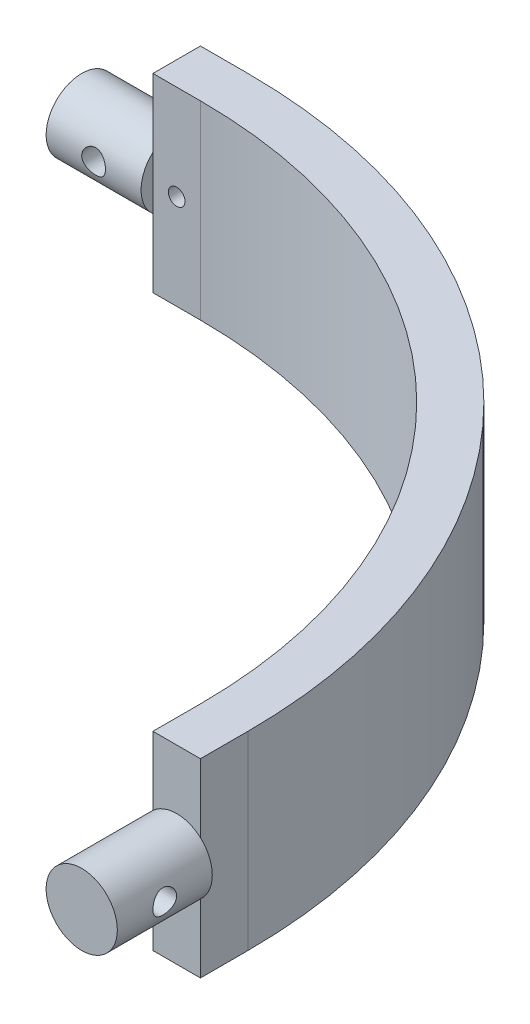
ISO-10303-21;
HEADER;
FILE_DESCRIPTION(('STEP AP214'),'2;1');
FILE_NAME('part.step','',(''),(''),'','','');
FILE_SCHEMA(('AUTOMOTIVE_DESIGN { 1 0 10303 214 1 1 1 1 }'));
ENDSEC;
DATA;
#1=APPLICATION_CONTEXT('core data for automotive mechanical design processes');
#2=APPLICATION_PROTOCOL_DEFINITION('international standard','automotive_design',2000,#1);
#3=PRODUCT_CONTEXT('',#1,'mechanical');
#4=PRODUCT('Part','Part','',(#3));
#5=PRODUCT_RELATED_PRODUCT_CATEGORY('part','',(#4));
#6=PRODUCT_DEFINITION_FORMATION('','',#4);
#7=PRODUCT_DEFINITION_CONTEXT('part definition',#1,'design');
#8=PRODUCT_DEFINITION('design','',#6,#7);
#9=PRODUCT_DEFINITION_SHAPE('','',#8);
#10=(LENGTH_UNIT() NAMED_UNIT(*) SI_UNIT(.MILLI.,.METRE.));
#11=(NAMED_UNIT(*) PLANE_ANGLE_UNIT() SI_UNIT($,.RADIAN.));
#12=(NAMED_UNIT(*) SI_UNIT($,.STERADIAN.) SOLID_ANGLE_UNIT());
#13=UNCERTAINTY_MEASURE_WITH_UNIT(LENGTH_MEASURE(1.E-05),#10,'distance_accuracy_value','');
#14=(GEOMETRIC_REPRESENTATION_CONTEXT(3) GLOBAL_UNCERTAINTY_ASSIGNED_CONTEXT((#13)) GLOBAL_UNIT_ASSIGNED_CONTEXT((#10,
#11,#12)) REPRESENTATION_CONTEXT('',''));
#15=CARTESIAN_POINT('',(0.,0.,0.));
#16=DIRECTION('',(0.,0.,1.));
#17=DIRECTION('',(1.,0.,0.));
#18=AXIS2_PLACEMENT_3D('',#15,#16,#17);
#19=CARTESIAN_POINT('',(0.,0.,12.7));
#20=DIRECTION('',(0.,0.,1.));
#21=DIRECTION('',(1.,0.,0.));
#22=AXIS2_PLACEMENT_3D('',#19,#20,#21);
#23=PLANE('',#22);
#24=CARTESIAN_POINT('',(146.05,0.,12.7));
#25=DIRECTION('',(0.,0.,1.));
#26=DIRECTION('',(1.,0.,0.));
#27=AXIS2_PLACEMENT_3D('',#24,#25,#26);
#28=CIRCLE('',#27,9.525);
#29=CARTESIAN_POINT('',(152.4,7.09951582856183,12.7));
#30=VERTEX_POINT('',#29);
#31=CARTESIAN_POINT('',(139.7,7.09951582856183,12.7));
#32=VERTEX_POINT('',#31);
#33=EDGE_CURVE('E48',#30,#32,#28,.T.);
#34=ORIENTED_EDGE('',*,*,#33,.F.);
#35=DIRECTION('',(0.,1.,0.));
#36=VECTOR('',#35,1.);
#37=CARTESIAN_POINT('',(152.4,25.4,12.7));
#38=LINE('',#37,#36);
#39=CARTESIAN_POINT('',(152.4,25.4,12.7));
#40=VERTEX_POINT('',#39);
#41=EDGE_CURVE('E137',#30,#40,#38,.T.);
#42=ORIENTED_EDGE('',*,*,#41,.T.);
#43=DIRECTION('',(-1.,0.,0.));
#44=VECTOR('',#43,1.);
#45=CARTESIAN_POINT('',(139.7,25.4,12.7));
#46=LINE('',#45,#44);
#47=CARTESIAN_POINT('',(139.7,25.4,12.7));
#48=VERTEX_POINT('',#47);
#49=EDGE_CURVE('E134',#40,#48,#46,.T.);
#50=ORIENTED_EDGE('',*,*,#49,.T.);
#51=DIRECTION('',(0.,-1.,0.));
#52=VECTOR('',#51,1.);
#53=CARTESIAN_POINT('',(139.7,25.4,12.7));
#54=LINE('',#53,#52);
#55=EDGE_CURVE('E166',#48,#32,#54,.T.);
#56=ORIENTED_EDGE('',*,*,#55,.T.);
#57=EDGE_LOOP('',(#34,#42,#50,#56));
#58=FACE_BOUND('',#57,.T.);
#59=ADVANCED_FACE('F33',(#58),#23,.T.);
#60=CARTESIAN_POINT('',(-12.7,0.,0.));
#61=DIRECTION('',(-1.,0.,0.));
#62=DIRECTION('',(0.,0.,1.));
#63=AXIS2_PLACEMENT_3D('',#60,#61,#62);
#64=PLANE('',#63);
#65=CARTESIAN_POINT('',(-12.7,0.,-146.05));
#66=DIRECTION('',(-1.,0.,0.));
#67=DIRECTION('',(0.,0.,1.));
#68=AXIS2_PLACEMENT_3D('',#65,#66,#67);
#69=CIRCLE('',#68,9.525);
#70=CARTESIAN_POINT('',(-12.7,7.09951582856183,-139.7));
#71=VERTEX_POINT('',#70);
#72=CARTESIAN_POINT('',(-12.7,7.09951582856183,-152.4));
#73=VERTEX_POINT('',#72);
#74=EDGE_CURVE('E161',#71,#73,#69,.T.);
#75=ORIENTED_EDGE('',*,*,#74,.F.);
#76=DIRECTION('',(0.,1.,0.));
#77=VECTOR('',#76,1.);
#78=CARTESIAN_POINT('',(-12.7,25.4,-139.7));
#79=LINE('',#78,#77);
#80=CARTESIAN_POINT('',(-12.7,25.4,-139.7));
#81=VERTEX_POINT('',#80);
#82=EDGE_CURVE('E189',#71,#81,#79,.T.);
#83=ORIENTED_EDGE('',*,*,#82,.T.);
#84=DIRECTION('',(0.,0.,-1.));
#85=VECTOR('',#84,1.);
#86=CARTESIAN_POINT('',(-12.7,25.4,-152.4));
#87=LINE('',#86,#85);
#88=CARTESIAN_POINT('',(-12.7,25.4,-152.4));
#89=VERTEX_POINT('',#88);
#90=EDGE_CURVE('E192',#81,#89,#87,.T.);
#91=ORIENTED_EDGE('',*,*,#90,.T.);
#92=DIRECTION('',(0.,-1.,0.));
#93=VECTOR('',#92,1.);
#94=CARTESIAN_POINT('',(-12.7,25.4,-152.4));
#95=LINE('',#94,#93);
#96=EDGE_CURVE('E183',#89,#73,#95,.T.);
#97=ORIENTED_EDGE('',*,*,#96,.T.);
#98=EDGE_LOOP('',(#75,#83,#91,#97));
#99=FACE_BOUND('',#98,.T.);
#100=ADVANCED_FACE('F262',(#99),#64,.T.);
#101=CARTESIAN_POINT('',(0.,25.4,0.));
#102=DIRECTION('',(0.,-1.,0.));
#103=DIRECTION('',(0.,0.,-1.));
#104=AXIS2_PLACEMENT_3D('',#101,#102,#103);
#105=CYLINDRICAL_SURFACE('',#104,152.4);
#106=CARTESIAN_POINT('',(0.,-25.4,0.));
#107=DIRECTION('',(0.,1.,0.));
#108=DIRECTION('',(0.,0.,1.));
#109=AXIS2_PLACEMENT_3D('',#106,#107,#108);
#110=CIRCLE('',#109,152.4);
#111=CARTESIAN_POINT('',(152.4,-25.4,0.));
#112=VERTEX_POINT('',#111);
#113=CARTESIAN_POINT('',(0.,-25.4,-152.4));
#114=VERTEX_POINT('',#113);
#115=EDGE_CURVE('E207',#112,#114,#110,.T.);
#116=ORIENTED_EDGE('',*,*,#115,.T.);
#117=DIRECTION('',(0.,-1.,0.));
#118=VECTOR('',#117,1.);
#119=CARTESIAN_POINT('',(0.,25.4,-152.4));
#120=LINE('',#119,#118);
#121=CARTESIAN_POINT('',(0.,25.4,-152.4));
#122=VERTEX_POINT('',#121);
#123=EDGE_CURVE('E222',#122,#114,#120,.T.);
#124=ORIENTED_EDGE('',*,*,#123,.F.);
#125=CARTESIAN_POINT('',(0.,25.4,0.));
#126=DIRECTION('',(0.,1.,0.));
#127=DIRECTION('',(0.,0.,1.));
#128=AXIS2_PLACEMENT_3D('',#125,#126,#127);
#129=CIRCLE('',#128,152.4);
#130=CARTESIAN_POINT('',(152.4,25.4,0.));
#131=VERTEX_POINT('',#130);
#132=EDGE_CURVE('E208',#131,#122,#129,.T.);
#133=ORIENTED_EDGE('',*,*,#132,.F.);
#134=DIRECTION('',(0.,-1.,0.));
#135=VECTOR('',#134,1.);
#136=CARTESIAN_POINT('',(152.4,25.4,0.));
#137=LINE('',#136,#135);
#138=EDGE_CURVE('E213',#131,#112,#137,.T.);
#139=ORIENTED_EDGE('',*,*,#138,.T.);
#140=EDGE_LOOP('',(#116,#124,#133,#139));
#141=FACE_BOUND('',#140,.T.);
#142=ADVANCED_FACE('F35',(#141),#105,.T.);
#143=CARTESIAN_POINT('',(0.,25.4,0.));
#144=DIRECTION('',(0.,-1.,0.));
#145=DIRECTION('',(0.,0.,-1.));
#146=AXIS2_PLACEMENT_3D('',#143,#144,#145);
#147=CYLINDRICAL_SURFACE('',#146,139.7);
#148=CARTESIAN_POINT('',(0.,-25.4,0.));
#149=DIRECTION('',(0.,-1.,0.));
#150=DIRECTION('',(0.,0.,1.));
#151=AXIS2_PLACEMENT_3D('',#148,#149,#150);
#152=CIRCLE('',#151,139.7);
#153=CARTESIAN_POINT('',(0.,-25.4,-139.7));
#154=VERTEX_POINT('',#153);
#155=CARTESIAN_POINT('',(139.7,-25.4,0.));
#156=VERTEX_POINT('',#155);
#157=EDGE_CURVE('E211',#154,#156,#152,.T.);
#158=ORIENTED_EDGE('',*,*,#157,.T.);
#159=DIRECTION('',(0.,-1.,0.));
#160=VECTOR('',#159,1.);
#161=CARTESIAN_POINT('',(139.7,25.4,0.));
#162=LINE('',#161,#160);
#163=CARTESIAN_POINT('',(139.7,25.4,0.));
#164=VERTEX_POINT('',#163);
#165=EDGE_CURVE('E217',#164,#156,#162,.T.);
#166=ORIENTED_EDGE('',*,*,#165,.F.);
#167=CARTESIAN_POINT('',(0.,25.4,0.));
#168=DIRECTION('',(0.,-1.,0.));
#169=DIRECTION('',(0.,0.,1.));
#170=AXIS2_PLACEMENT_3D('',#167,#168,#169);
#171=CIRCLE('',#170,139.7);
#172=CARTESIAN_POINT('',(0.,25.4,-139.7));
#173=VERTEX_POINT('',#172);
#174=EDGE_CURVE('E210',#173,#164,#171,.T.);
#175=ORIENTED_EDGE('',*,*,#174,.F.);
#176=DIRECTION('',(0.,-1.,0.));
#177=VECTOR('',#176,1.);
#178=CARTESIAN_POINT('',(0.,25.4,-139.7));
#179=LINE('',#178,#177);
#180=EDGE_CURVE('E220',#173,#154,#179,.T.);
#181=ORIENTED_EDGE('',*,*,#180,.T.);
#182=EDGE_LOOP('',(#158,#166,#175,#181));
#183=FACE_BOUND('',#182,.T.);
#184=ADVANCED_FACE('F290',(#183),#147,.F.);
#185=CARTESIAN_POINT('',(0.,25.4,0.));
#186=DIRECTION('',(0.,1.,0.));
#187=DIRECTION('',(0.,0.,1.));
#188=AXIS2_PLACEMENT_3D('',#185,#186,#187);
#189=PLANE('',#188);
#190=ORIENTED_EDGE('',*,*,#132,.T.);
#191=DIRECTION('',(1.,0.,0.));
#192=VECTOR('',#191,1.);
#193=CARTESIAN_POINT('',(-12.7,25.4,-152.4));
#194=LINE('',#193,#192);
#195=EDGE_CURVE('E195',#89,#122,#194,.T.);
#196=ORIENTED_EDGE('',*,*,#195,.F.);
#197=ORIENTED_EDGE('',*,*,#90,.F.);
#198=DIRECTION('',(1.,0.,0.));
#199=VECTOR('',#198,1.);
#200=CARTESIAN_POINT('',(-12.7,25.4,-139.7));
#201=LINE('',#200,#199);
#202=EDGE_CURVE('E198',#81,#173,#201,.T.);
#203=ORIENTED_EDGE('',*,*,#202,.T.);
#204=ORIENTED_EDGE('',*,*,#174,.T.);
#205=DIRECTION('',(0.,0.,-1.));
#206=VECTOR('',#205,1.);
#207=CARTESIAN_POINT('',(139.7,25.4,12.7));
#208=LINE('',#207,#206);
#209=EDGE_CURVE('E171',#48,#164,#208,.T.);
#210=ORIENTED_EDGE('',*,*,#209,.F.);
#211=ORIENTED_EDGE('',*,*,#49,.F.);
#212=DIRECTION('',(0.,0.,-1.));
#213=VECTOR('',#212,1.);
#214=CARTESIAN_POINT('',(152.4,25.4,12.7));
#215=LINE('',#214,#213);
#216=EDGE_CURVE('E174',#40,#131,#215,.T.);
#217=ORIENTED_EDGE('',*,*,#216,.T.);
#218=EDGE_LOOP('',(#190,#196,#197,#203,#204,#210,#211,#217));
#219=FACE_BOUND('',#218,.T.);
#220=ADVANCED_FACE('F287',(#219),#189,.T.);
#221=CARTESIAN_POINT('',(0.,-25.4,0.));
#222=DIRECTION('',(0.,1.,0.));
#223=DIRECTION('',(0.,0.,1.));
#224=AXIS2_PLACEMENT_3D('',#221,#222,#223);
#225=PLANE('',#224);
#226=ORIENTED_EDGE('',*,*,#115,.F.);
#227=DIRECTION('',(0.,0.,-1.));
#228=VECTOR('',#227,1.);
#229=CARTESIAN_POINT('',(152.4,-25.4,12.7));
#230=LINE('',#229,#228);
#231=CARTESIAN_POINT('',(152.4,-25.4,12.7));
#232=VERTEX_POINT('',#231);
#233=EDGE_CURVE('E177',#232,#112,#230,.T.);
#234=ORIENTED_EDGE('',*,*,#233,.F.);
#235=DIRECTION('',(1.,0.,0.));
#236=VECTOR('',#235,1.);
#237=CARTESIAN_POINT('',(139.7,-25.4,12.7));
#238=LINE('',#237,#236);
#239=CARTESIAN_POINT('',(139.7,-25.4,12.7));
#240=VERTEX_POINT('',#239);
#241=EDGE_CURVE('E130',#240,#232,#238,.T.);
#242=ORIENTED_EDGE('',*,*,#241,.F.);
#243=DIRECTION('',(0.,0.,-1.));
#244=VECTOR('',#243,1.);
#245=CARTESIAN_POINT('',(139.7,-25.4,12.7));
#246=LINE('',#245,#244);
#247=EDGE_CURVE('E179',#240,#156,#246,.T.);
#248=ORIENTED_EDGE('',*,*,#247,.T.);
#249=ORIENTED_EDGE('',*,*,#157,.F.);
#250=DIRECTION('',(1.,0.,0.));
#251=VECTOR('',#250,1.);
#252=CARTESIAN_POINT('',(-12.7,-25.4,-139.7));
#253=LINE('',#252,#251);
#254=CARTESIAN_POINT('',(-12.7,-25.4,-139.7));
#255=VERTEX_POINT('',#254);
#256=EDGE_CURVE('E201',#255,#154,#253,.T.);
#257=ORIENTED_EDGE('',*,*,#256,.F.);
#258=DIRECTION('',(0.,0.,1.));
#259=VECTOR('',#258,1.);
#260=CARTESIAN_POINT('',(-12.7,-25.4,-152.4));
#261=LINE('',#260,#259);
#262=CARTESIAN_POINT('',(-12.7,-25.4,-152.4));
#263=VERTEX_POINT('',#262);
#264=EDGE_CURVE('E186',#263,#255,#261,.T.);
#265=ORIENTED_EDGE('',*,*,#264,.F.);
#266=DIRECTION('',(1.,0.,0.));
#267=VECTOR('',#266,1.);
#268=CARTESIAN_POINT('',(-12.7,-25.4,-152.4));
#269=LINE('',#268,#267);
#270=EDGE_CURVE('E204',#263,#114,#269,.T.);
#271=ORIENTED_EDGE('',*,*,#270,.T.);
#272=EDGE_LOOP('',(#226,#234,#242,#248,#249,#257,#265,#271));
#273=FACE_BOUND('',#272,.T.);
#274=ADVANCED_FACE('F285',(#273),#225,.F.);
#275=CARTESIAN_POINT('',(-12.7,25.4,-152.4));
#276=DIRECTION('',(0.,0.,1.));
#277=DIRECTION('',(1.,0.,0.));
#278=AXIS2_PLACEMENT_3D('',#275,#276,#277);
#279=PLANE('',#278);
#280=ORIENTED_EDGE('',*,*,#123,.T.);
#281=ORIENTED_EDGE('',*,*,#270,.F.);
#282=CARTESIAN_POINT('',(-12.7,-7.09951582856183,-152.4));
#283=VERTEX_POINT('',#282);
#284=EDGE_CURVE('E182',#283,#263,#95,.T.);
#285=ORIENTED_EDGE('',*,*,#284,.F.);
#286=EDGE_CURVE('E187',#73,#283,#95,.T.);
#287=ORIENTED_EDGE('',*,*,#286,.F.);
#288=ORIENTED_EDGE('',*,*,#96,.F.);
#289=ORIENTED_EDGE('',*,*,#195,.T.);
#290=EDGE_LOOP('',(#280,#281,#285,#287,#288,#289));
#291=FACE_BOUND('',#290,.T.);
#292=ADVANCED_FACE('F281',(#291),#279,.F.);
#293=CARTESIAN_POINT('',(-12.7,25.4,-139.7));
#294=DIRECTION('',(0.,0.,-1.));
#295=DIRECTION('',(-1.,0.,0.));
#296=AXIS2_PLACEMENT_3D('',#293,#294,#295);
#297=PLANE('',#296);
#298=CARTESIAN_POINT('',(-6.35,0.,-139.7));
#299=DIRECTION('',(0.,0.,1.));
#300=DIRECTION('',(1.,0.,0.));
#301=AXIS2_PLACEMENT_3D('',#298,#299,#300);
#302=CIRCLE('',#301,2.2225);
#303=CARTESIAN_POINT('',(-4.1275,0.,-139.7));
#304=VERTEX_POINT('',#303);
#305=EDGE_CURVE('E539',#304,#304,#302,.T.);
#306=ORIENTED_EDGE('',*,*,#305,.F.);
#307=EDGE_LOOP('',(#306));
#308=FACE_BOUND('',#307,.T.);
#309=ORIENTED_EDGE('',*,*,#180,.F.);
#310=ORIENTED_EDGE('',*,*,#202,.F.);
#311=ORIENTED_EDGE('',*,*,#82,.F.);
#312=CARTESIAN_POINT('',(-12.7,-7.09951582856183,-139.7));
#313=VERTEX_POINT('',#312);
#314=EDGE_CURVE('E193',#313,#71,#79,.T.);
#315=ORIENTED_EDGE('',*,*,#314,.F.);
#316=EDGE_CURVE('E190',#255,#313,#79,.T.);
#317=ORIENTED_EDGE('',*,*,#316,.F.);
#318=ORIENTED_EDGE('',*,*,#256,.T.);
#319=EDGE_LOOP('',(#309,#310,#311,#315,#317,#318));
#320=FACE_BOUND('',#319,.T.);
#321=ADVANCED_FACE('F277',(#308,#320),#297,.F.);
#322=EDGE_CURVE('E46',#283,#313,#69,.T.);
#323=ORIENTED_EDGE('',*,*,#322,.F.);
#324=ORIENTED_EDGE('',*,*,#284,.T.);
#325=ORIENTED_EDGE('',*,*,#264,.T.);
#326=ORIENTED_EDGE('',*,*,#316,.T.);
#327=EDGE_LOOP('',(#323,#324,#325,#326));
#328=FACE_BOUND('',#327,.T.);
#329=ADVANCED_FACE('F268',(#328),#64,.T.);
#330=CARTESIAN_POINT('',(139.7,25.4,12.7));
#331=DIRECTION('',(1.,0.,0.));
#332=DIRECTION('',(0.,0.,-1.));
#333=AXIS2_PLACEMENT_3D('',#330,#331,#332);
#334=PLANE('',#333);
#335=CARTESIAN_POINT('',(139.7,0.,6.35));
#336=DIRECTION('',(-1.,0.,0.));
#337=DIRECTION('',(0.,0.,1.));
#338=AXIS2_PLACEMENT_3D('',#335,#336,#337);
#339=CIRCLE('',#338,2.2225);
#340=CARTESIAN_POINT('',(139.7,0.,8.5725));
#341=VERTEX_POINT('',#340);
#342=EDGE_CURVE('E545',#341,#341,#339,.T.);
#343=ORIENTED_EDGE('',*,*,#342,.F.);
#344=EDGE_LOOP('',(#343));
#345=FACE_BOUND('',#344,.T.);
#346=ORIENTED_EDGE('',*,*,#165,.T.);
#347=ORIENTED_EDGE('',*,*,#247,.F.);
#348=CARTESIAN_POINT('',(139.7,-7.09951582856183,12.7));
#349=VERTEX_POINT('',#348);
#350=EDGE_CURVE('E160',#349,#240,#54,.T.);
#351=ORIENTED_EDGE('',*,*,#350,.F.);
#352=EDGE_CURVE('E168',#32,#349,#54,.T.);
#353=ORIENTED_EDGE('',*,*,#352,.F.);
#354=ORIENTED_EDGE('',*,*,#55,.F.);
#355=ORIENTED_EDGE('',*,*,#209,.T.);
#356=EDGE_LOOP('',(#346,#347,#351,#353,#354,#355));
#357=FACE_BOUND('',#356,.T.);
#358=ADVANCED_FACE('F272',(#345,#357),#334,.F.);
#359=CARTESIAN_POINT('',(152.4,25.4,12.7));
#360=DIRECTION('',(-1.,0.,0.));
#361=DIRECTION('',(0.,0.,1.));
#362=AXIS2_PLACEMENT_3D('',#359,#360,#361);
#363=PLANE('',#362);
#364=ORIENTED_EDGE('',*,*,#138,.F.);
#365=ORIENTED_EDGE('',*,*,#216,.F.);
#366=ORIENTED_EDGE('',*,*,#41,.F.);
#367=CARTESIAN_POINT('',(152.4,-7.09951582856183,12.7));
#368=VERTEX_POINT('',#367);
#369=EDGE_CURVE('E135',#368,#30,#38,.T.);
#370=ORIENTED_EDGE('',*,*,#369,.F.);
#371=EDGE_CURVE('E126',#232,#368,#38,.T.);
#372=ORIENTED_EDGE('',*,*,#371,.F.);
#373=ORIENTED_EDGE('',*,*,#233,.T.);
#374=EDGE_LOOP('',(#364,#365,#366,#370,#372,#373));
#375=FACE_BOUND('',#374,.T.);
#376=ADVANCED_FACE('F141',(#375),#363,.F.);
#377=EDGE_CURVE('E11',#349,#368,#28,.T.);
#378=ORIENTED_EDGE('',*,*,#377,.F.);
#379=ORIENTED_EDGE('',*,*,#350,.T.);
#380=ORIENTED_EDGE('',*,*,#241,.T.);
#381=ORIENTED_EDGE('',*,*,#371,.T.);
#382=EDGE_LOOP('',(#378,#379,#380,#381));
#383=FACE_BOUND('',#382,.T.);
#384=ADVANCED_FACE('F128',(#383),#23,.T.);
#385=CARTESIAN_POINT('',(-12.7,0.,-146.05));
#386=DIRECTION('',(-1.,0.,0.));
#387=DIRECTION('',(0.,0.,1.));
#388=AXIS2_PLACEMENT_3D('',#385,#386,#387);
#389=PLANE('',#388);
#390=EDGE_CURVE('E164',#73,#283,#69,.T.);
#391=ORIENTED_EDGE('',*,*,#390,.F.);
#392=ORIENTED_EDGE('',*,*,#286,.T.);
#393=EDGE_LOOP('',(#391,#392));
#394=FACE_BOUND('',#393,.T.);
#395=ADVANCED_FACE('F251',(#394),#389,.F.);
#396=EDGE_CURVE('E165',#313,#71,#69,.T.);
#397=ORIENTED_EDGE('',*,*,#396,.F.);
#398=ORIENTED_EDGE('',*,*,#314,.T.);
#399=EDGE_LOOP('',(#397,#398));
#400=FACE_BOUND('',#399,.T.);
#401=ADVANCED_FACE('F253',(#400),#389,.F.);
#402=CARTESIAN_POINT('',(-38.1,0.,-146.05));
#403=DIRECTION('',(1.,0.,0.));
#404=DIRECTION('',(0.,0.,-1.));
#405=AXIS2_PLACEMENT_3D('',#402,#403,#404);
#406=CYLINDRICAL_SURFACE('',#405,9.525);
#407=CARTESIAN_POINT('',(-28.575,0.,-155.575));
#408=CARTESIAN_POINT('',(-28.575000805598,-0.173238677165347,-155.575000485805));
#409=CARTESIAN_POINT('',(-28.5607751550461,-0.346472492659896,-155.570230181865));
#410=CARTESIAN_POINT('',(-28.5044225795053,-0.687837590771687,-155.551670423954));
#411=CARTESIAN_POINT('',(-28.4622927579622,-0.855968341777246,-155.537880033668));
#412=CARTESIAN_POINT('',(-28.3517364022556,-1.18215660666814,-155.50277852603));
#413=CARTESIAN_POINT('',(-28.2833538266918,-1.34023044718816,-155.481479985455));
#414=CARTESIAN_POINT('',(-28.1224317762382,-1.64266542435691,-155.433536151526));
#415=CARTESIAN_POINT('',(-28.0298875361167,-1.78702384834389,-155.406889803702));
#416=CARTESIAN_POINT('',(-27.8199030695735,-2.0629298181957,-155.350022498565));
#417=CARTESIAN_POINT('',(-27.7017758312229,-2.19393674844713,-155.319715917725));
#418=CARTESIAN_POINT('',(-27.4454392838066,-2.43469379932912,-155.259414994364));
#419=CARTESIAN_POINT('',(-27.307225564102,-2.54443923892904,-155.229420721975));
#420=CARTESIAN_POINT('',(-27.0097722592512,-2.74264419157345,-155.172198306153));
#421=CARTESIAN_POINT('',(-26.8500423763505,-2.83040092485178,-155.145074497003));
#422=CARTESIAN_POINT('',(-26.5170409000941,-2.97757492456177,-155.097965947041));
#423=CARTESIAN_POINT('',(-26.3437734580083,-3.03700083920298,-155.077979028104));
#424=CARTESIAN_POINT('',(-25.9947625217479,-3.1237982402916,-155.048308878803));
#425=CARTESIAN_POINT('',(-25.8192993630472,-3.15218269826287,-155.038301040685));
#426=CARTESIAN_POINT('',(-25.4658375805551,-3.17925806658697,-155.028762097987));
#427=CARTESIAN_POINT('',(-25.2878397572483,-3.17795815259498,-155.029227755972));
#428=CARTESIAN_POINT('',(-24.9430011983402,-3.14648819425836,-155.04029872651));
#429=CARTESIAN_POINT('',(-24.7760223207321,-3.11764017430521,-155.050439703794));
#430=CARTESIAN_POINT('',(-24.4494258927483,-3.0340495670469,-155.078958882754));
#431=CARTESIAN_POINT('',(-24.2898092262437,-2.97930387942919,-155.097338070645));
#432=CARTESIAN_POINT('',(-23.9794645200471,-2.84460650934117,-155.140593678417));
#433=CARTESIAN_POINT('',(-23.8289210191343,-2.76426310464556,-155.165569963931));
#434=CARTESIAN_POINT('',(-23.5430348662119,-2.58092291251247,-155.219163734779));
#435=CARTESIAN_POINT('',(-23.4076966219865,-2.47791958175571,-155.247782270847));
#436=CARTESIAN_POINT('',(-23.1486341758395,-2.2458341312661,-155.307262701076));
#437=CARTESIAN_POINT('',(-23.0258851949337,-2.11567125149229,-155.338163712016));
#438=CARTESIAN_POINT('',(-22.8037032283437,-1.83622813465495,-155.397420293788));
#439=CARTESIAN_POINT('',(-22.7042724788277,-1.68694606622309,-155.425775620334));
#440=CARTESIAN_POINT('',(-22.5307642467537,-1.3714336714219,-155.477118177025));
#441=CARTESIAN_POINT('',(-22.4569480649932,-1.20504990262187,-155.500049362755));
#442=CARTESIAN_POINT('',(-22.3386549226906,-0.861279339682312,-155.537553006836));
#443=CARTESIAN_POINT('',(-22.2941677705306,-0.683896391141978,-155.552128368542));
#444=CARTESIAN_POINT('',(-22.237523260379,-0.33141865875554,-155.570797159518));
#445=CARTESIAN_POINT('',(-22.2240481058765,-0.156557979570887,-155.575317558221));
#446=CARTESIAN_POINT('',(-22.2260562386751,0.192960847123754,-155.574647660561));
#447=CARTESIAN_POINT('',(-22.2415346379361,0.367619023839891,-155.569459003315));
#448=CARTESIAN_POINT('',(-22.2999678070617,0.706500575516014,-155.550235784768));
#449=CARTESIAN_POINT('',(-22.3421137042071,0.870879661700631,-155.53646180908));
#450=CARTESIAN_POINT('',(-22.4516741861819,1.19016766849015,-155.501716136855));
#451=CARTESIAN_POINT('',(-22.5190919933102,1.34507537851483,-155.480743522482));
#452=CARTESIAN_POINT('',(-22.6792486210945,1.64556534104864,-155.433043568371));
#453=CARTESIAN_POINT('',(-22.7726068336741,1.79079512051444,-155.406179368496));
#454=CARTESIAN_POINT('',(-22.9812664262928,2.06395583568048,-155.349741811841));
#455=CARTESIAN_POINT('',(-23.0965745079009,2.19188146775096,-155.320167629104));
#456=CARTESIAN_POINT('',(-23.3520575344459,2.432851712285,-155.259939923379));
#457=CARTESIAN_POINT('',(-23.4931242954928,2.54495607735532,-155.229298414526));
#458=CARTESIAN_POINT('',(-23.7927247277996,2.74401763337735,-155.171774152107));
#459=CARTESIAN_POINT('',(-23.9512585446632,2.83097461468097,-155.144891429879));
#460=CARTESIAN_POINT('',(-24.2813618235454,2.97687025407195,-155.098190939376));
#461=CARTESIAN_POINT('',(-24.4529041013608,3.03586556962394,-155.078358905177));
#462=CARTESIAN_POINT('',(-24.8043022138901,3.12386556696096,-155.04829392573));
#463=CARTESIAN_POINT('',(-24.9841542651588,3.15288375947876,-155.038056656301));
#464=CARTESIAN_POINT('',(-25.3371257799299,3.17905219686556,-155.028832019255));
#465=CARTESIAN_POINT('',(-25.5101164304107,3.17776306695417,-155.029293708173));
#466=CARTESIAN_POINT('',(-25.8532791128775,3.1471942816996,-155.040052816908));
#467=CARTESIAN_POINT('',(-26.0234513120074,3.11791629228101,-155.050349651327));
#468=CARTESIAN_POINT('',(-26.3529307300328,3.03330550668567,-155.07920864668));
#469=CARTESIAN_POINT('',(-26.5123829193893,2.97847812359926,-155.097610112214));
#470=CARTESIAN_POINT('',(-26.819947017029,2.8447344862872,-155.140545662486));
#471=CARTESIAN_POINT('',(-26.9680563990219,2.76581288515833,-155.165081108238));
#472=CARTESIAN_POINT('',(-27.2557356520052,2.58210269895239,-155.218854827927));
#473=CARTESIAN_POINT('',(-27.3946508935274,2.47633567077754,-155.248251594638));
#474=CARTESIAN_POINT('',(-27.6532651574948,2.24359115395569,-155.307771561993));
#475=CARTESIAN_POINT('',(-27.7729587278096,2.11660766813346,-155.337894965968));
#476=CARTESIAN_POINT('',(-27.9944335090181,1.83909194322319,-155.396883469186));
#477=CARTESIAN_POINT('',(-28.0953348041094,1.68783480536165,-155.42565377219));
#478=CARTESIAN_POINT('',(-28.2701696116008,1.36955960976604,-155.47740021973));
#479=CARTESIAN_POINT('',(-28.3441100183025,1.20254559507021,-155.500377845077));
#480=CARTESIAN_POINT('',(-28.4598161831515,0.8651673298631,-155.537075103426));
#481=CARTESIAN_POINT('',(-28.5028718303862,0.695286130622597,-155.551162494415));
#482=CARTESIAN_POINT('',(-28.5604593911499,0.350267320832533,-155.570123424289));
#483=CARTESIAN_POINT('',(-28.5749991856015,0.175131176180769,-155.574999508888));
#484=CARTESIAN_POINT('',(-28.575,0.,-155.575));
#485=B_SPLINE_CURVE_WITH_KNOTS('',3,(#407,#408,#409,#410,#411,#412,#413,#414,#415,#416,#417,
#418,#419,#420,#421,#422,#423,#424,#425,#426,#427,#428,#429,#430,#431,#432,#433,#434,#435,#436,
#437,#438,#439,#440,#441,#442,#443,#444,#445,#446,#447,#448,#449,#450,#451,#452,#453,#454,#455,
#456,#457,#458,#459,#460,#461,#462,#463,#464,#465,#466,#467,#468,#469,#470,#471,#472,#473,#474,
#475,#476,#477,#478,#479,#480,#481,#482,#483,#484),.UNSPECIFIED.,.T.,.F.,(4,2,2,2,2,2,2,2,2,2,2,
2,2,2,2,2,2,2,2,2,2,2,2,2,2,2,2,2,2,2,2,2,2,2,2,2,2,2,4),(0.,0.519071561632586,1.03819701322438,
1.55645698636312,2.07481924951214,2.6093637259775,3.14402575687909,3.69406121814519,
4.24392866899746,4.77526114230343,5.30642937910266,5.81332424300315,6.32027980466155,
6.8353994341754,7.35066800622309,7.89283745951091,8.43505888444013,8.98265937939886,
9.53006948685136,10.0537512658116,10.5773446429626,11.0857715158083,11.5942632377703,
12.1161301950386,12.638156741095,13.1839024764639,13.7296527614612,14.274292439,
14.8186865394104,15.3351123975402,15.8515075194062,16.3580948898033,16.8647947620873,
17.3936046174648,17.92256420318,18.4721392315144,19.0215736265905,19.5464607283686,
20.0712027467109),.UNSPECIFIED.);
#486=CARTESIAN_POINT('',(-28.575,0.,-155.575));
#487=VERTEX_POINT('',#486);
#488=EDGE_CURVE('E232',#487,#487,#485,.T.);
#489=ORIENTED_EDGE('',*,*,#488,.T.);
#490=EDGE_LOOP('',(#489));
#491=FACE_BOUND('',#490,.T.);
#492=CARTESIAN_POINT('',(-22.225,0.,-136.525));
#493=CARTESIAN_POINT('',(-22.224999194402,-0.173238677165346,-136.524999514195));
#494=CARTESIAN_POINT('',(-22.2392248449539,-0.346472492659896,-136.529769818135));
#495=CARTESIAN_POINT('',(-22.2955774204947,-0.687837590771687,-136.548329576046));
#496=CARTESIAN_POINT('',(-22.3377072420378,-0.855968341777246,-136.562119966332));
#497=CARTESIAN_POINT('',(-22.4482635977444,-1.18215660666814,-136.59722147397));
#498=CARTESIAN_POINT('',(-22.5166461733082,-1.34023044718816,-136.618520014545));
#499=CARTESIAN_POINT('',(-22.6775682237617,-1.64266542435691,-136.666463848474));
#500=CARTESIAN_POINT('',(-22.7701124638833,-1.78702384834389,-136.693110196298));
#501=CARTESIAN_POINT('',(-22.9800969304265,-2.0629298181957,-136.749977501435));
#502=CARTESIAN_POINT('',(-23.0982241687771,-2.19393674844714,-136.780284082275));
#503=CARTESIAN_POINT('',(-23.3545607161933,-2.43469379932912,-136.840585005636));
#504=CARTESIAN_POINT('',(-23.492774435898,-2.54443923892905,-136.870579278025));
#505=CARTESIAN_POINT('',(-23.7902277407488,-2.74264419157345,-136.927801693847));
#506=CARTESIAN_POINT('',(-23.9499576236495,-2.83040092485178,-136.954925502997));
#507=CARTESIAN_POINT('',(-24.2829590999059,-2.97757492456177,-137.002034052959));
#508=CARTESIAN_POINT('',(-24.4562265419917,-3.03700083920298,-137.022020971896));
#509=CARTESIAN_POINT('',(-24.8052374782521,-3.1237982402916,-137.051691121197));
#510=CARTESIAN_POINT('',(-24.9807006369528,-3.15218269826287,-137.061698959315));
#511=CARTESIAN_POINT('',(-25.3341624194449,-3.17925806658697,-137.071237902013));
#512=CARTESIAN_POINT('',(-25.5121602427517,-3.17795815259498,-137.070772244028));
#513=CARTESIAN_POINT('',(-25.8569988016598,-3.14648819425836,-137.05970127349));
#514=CARTESIAN_POINT('',(-26.0239776792679,-3.11764017430521,-137.049560296206));
#515=CARTESIAN_POINT('',(-26.3505741072517,-3.0340495670469,-137.021041117245));
#516=CARTESIAN_POINT('',(-26.5101907737563,-2.97930387942919,-137.002661929355));
#517=CARTESIAN_POINT('',(-26.8205354799529,-2.84460650934117,-136.959406321583));
#518=CARTESIAN_POINT('',(-26.9710789808657,-2.76426310464556,-136.934430036069));
#519=CARTESIAN_POINT('',(-27.2569651337881,-2.58092291251247,-136.880836265221));
#520=CARTESIAN_POINT('',(-27.3923033780135,-2.47791958175571,-136.852217729153));
#521=CARTESIAN_POINT('',(-27.6513658241605,-2.2458341312661,-136.792737298924));
#522=CARTESIAN_POINT('',(-27.7741148050663,-2.11567125149229,-136.761836287984));
#523=CARTESIAN_POINT('',(-27.9962967716563,-1.83622813465495,-136.702579706212));
#524=CARTESIAN_POINT('',(-28.0957275211723,-1.68694606622309,-136.674224379666));
#525=CARTESIAN_POINT('',(-28.2692357532463,-1.3714336714219,-136.622881822975));
#526=CARTESIAN_POINT('',(-28.3430519350068,-1.20504990262187,-136.599950637245));
#527=CARTESIAN_POINT('',(-28.4613450773094,-0.861279339682312,-136.562446993164));
#528=CARTESIAN_POINT('',(-28.5058322294694,-0.683896391141978,-136.547871631458));
#529=CARTESIAN_POINT('',(-28.562476739621,-0.331418658755541,-136.529202840482));
#530=CARTESIAN_POINT('',(-28.5759518941235,-0.156557979570887,-136.524682441779));
#531=CARTESIAN_POINT('',(-28.5739437613249,0.192960847123754,-136.525352339439));
#532=CARTESIAN_POINT('',(-28.5584653620639,0.367619023839891,-136.530540996685));
#533=CARTESIAN_POINT('',(-28.5000321929383,0.706500575516014,-136.549764215232));
#534=CARTESIAN_POINT('',(-28.4578862957929,0.870879661700631,-136.56353819092));
#535=CARTESIAN_POINT('',(-28.3483258138181,1.19016766849015,-136.598283863145));
#536=CARTESIAN_POINT('',(-28.2809080066898,1.34507537851483,-136.619256477518));
#537=CARTESIAN_POINT('',(-28.1207513789055,1.64556534104865,-136.666956431629));
#538=CARTESIAN_POINT('',(-28.0273931663259,1.79079512051445,-136.693820631504));
#539=CARTESIAN_POINT('',(-27.8187335737072,2.06395583568049,-136.750258188159));
#540=CARTESIAN_POINT('',(-27.7034254920991,2.19188146775096,-136.779832370896));
#541=CARTESIAN_POINT('',(-27.4479424655541,2.432851712285,-136.840060076621));
#542=CARTESIAN_POINT('',(-27.3068757045072,2.54495607735532,-136.870701585474));
#543=CARTESIAN_POINT('',(-27.0072752722004,2.74401763337735,-136.928225847893));
#544=CARTESIAN_POINT('',(-26.8487414553368,2.83097461468097,-136.955108570121));
#545=CARTESIAN_POINT('',(-26.5186381764546,2.97687025407195,-137.001809060624));
#546=CARTESIAN_POINT('',(-26.3470958986392,3.03586556962394,-137.021641094823));
#547=CARTESIAN_POINT('',(-25.9956977861099,3.12386556696096,-137.05170607427));
#548=CARTESIAN_POINT('',(-25.8158457348412,3.15288375947876,-137.061943343699));
#549=CARTESIAN_POINT('',(-25.4628742200701,3.17905219686556,-137.071167980745));
#550=CARTESIAN_POINT('',(-25.2898835695893,3.17776306695417,-137.070706291827));
#551=CARTESIAN_POINT('',(-24.9467208871224,3.1471942816996,-137.059947183092));
#552=CARTESIAN_POINT('',(-24.7765486879926,3.11791629228101,-137.049650348673));
#553=CARTESIAN_POINT('',(-24.4470692699671,3.03330550668567,-137.02079135332));
#554=CARTESIAN_POINT('',(-24.2876170806107,2.97847812359926,-137.002389887786));
#555=CARTESIAN_POINT('',(-23.980052982971,2.8447344862872,-136.959454337514));
#556=CARTESIAN_POINT('',(-23.8319436009781,2.76581288515833,-136.934918891762));
#557=CARTESIAN_POINT('',(-23.5442643479948,2.58210269895239,-136.881145172073));
#558=CARTESIAN_POINT('',(-23.4053491064726,2.47633567077755,-136.851748405362));
#559=CARTESIAN_POINT('',(-23.1467348425052,2.24359115395569,-136.792228438007));
#560=CARTESIAN_POINT('',(-23.0270412721904,2.11660766813346,-136.762105034032));
#561=CARTESIAN_POINT('',(-22.8055664909819,1.83909194322319,-136.703116530814));
#562=CARTESIAN_POINT('',(-22.7046651958906,1.68783480536164,-136.67434622781));
#563=CARTESIAN_POINT('',(-22.5298303883992,1.36955960976604,-136.62259978027));
#564=CARTESIAN_POINT('',(-22.4558899816975,1.20254559507021,-136.599622154923));
#565=CARTESIAN_POINT('',(-22.3401838168485,0.865167329863103,-136.562924896574));
#566=CARTESIAN_POINT('',(-22.2971281696138,0.695286130622601,-136.548837505585));
#567=CARTESIAN_POINT('',(-22.2395406088501,0.350267320832535,-136.529876575711));
#568=CARTESIAN_POINT('',(-22.2250008143985,0.17513117618077,-136.525000491112));
#569=CARTESIAN_POINT('',(-22.225,0.,-136.525));
#570=B_SPLINE_CURVE_WITH_KNOTS('',3,(#492,#493,#494,#495,#496,#497,#498,#499,#500,#501,#502,
#503,#504,#505,#506,#507,#508,#509,#510,#511,#512,#513,#514,#515,#516,#517,#518,#519,#520,#521,
#522,#523,#524,#525,#526,#527,#528,#529,#530,#531,#532,#533,#534,#535,#536,#537,#538,#539,#540,
#541,#542,#543,#544,#545,#546,#547,#548,#549,#550,#551,#552,#553,#554,#555,#556,#557,#558,#559,
#560,#561,#562,#563,#564,#565,#566,#567,#568,#569),.UNSPECIFIED.,.T.,.F.,(4,2,2,2,2,2,2,2,2,2,2,
2,2,2,2,2,2,2,2,2,2,2,2,2,2,2,2,2,2,2,2,2,2,2,2,2,2,2,4),(0.,0.519071561632585,1.03819701322438,
1.55645698636312,2.07481924951215,2.60936372597751,3.14402575687909,3.69406121814519,
4.24392866899746,4.77526114230343,5.30642937910266,5.81332424300315,6.32027980466155,
6.8353994341754,7.35066800622308,7.8928374595109,8.43505888444013,8.98265937939885,
9.53006948685136,10.0537512658116,10.5773446429626,11.0857715158083,11.5942632377703,
12.1161301950386,12.638156741095,13.1839024764639,13.7296527614612,14.274292439,
14.8186865394104,15.3351123975402,15.8515075194062,16.3580948898033,16.8647947620873,
17.3936046174648,17.92256420318,18.4721392315144,19.0215736265905,19.5464607283686,
20.0712027467109),.UNSPECIFIED.);
#571=CARTESIAN_POINT('',(-22.225,0.,-136.525));
#572=VERTEX_POINT('',#571);
#573=EDGE_CURVE('E225',#572,#572,#570,.T.);
#574=ORIENTED_EDGE('',*,*,#573,.T.);
#575=EDGE_LOOP('',(#574));
#576=FACE_BOUND('',#575,.T.);
#577=CARTESIAN_POINT('',(-38.1,0.,-146.05));
#578=DIRECTION('',(-1.,0.,0.));
#579=DIRECTION('',(0.,0.,1.));
#580=AXIS2_PLACEMENT_3D('',#577,#578,#579);
#581=CIRCLE('',#580,9.525);
#582=CARTESIAN_POINT('',(-38.1,0.,-136.525));
#583=VERTEX_POINT('',#582);
#584=EDGE_CURVE('E157',#583,#583,#581,.T.);
#585=ORIENTED_EDGE('',*,*,#584,.F.);
#586=EDGE_LOOP('',(#585));
#587=FACE_BOUND('',#586,.T.);
#588=ORIENTED_EDGE('',*,*,#74,.T.);
#589=ORIENTED_EDGE('',*,*,#390,.T.);
#590=ORIENTED_EDGE('',*,*,#322,.T.);
#591=ORIENTED_EDGE('',*,*,#396,.T.);
#592=EDGE_LOOP('',(#588,#589,#590,#591));
#593=FACE_BOUND('',#592,.T.);
#594=ADVANCED_FACE('F235',(#491,#576,#587,#593),#406,.T.);
#595=CARTESIAN_POINT('',(-38.1,0.,-146.05));
#596=DIRECTION('',(-1.,0.,0.));
#597=DIRECTION('',(0.,0.,1.));
#598=AXIS2_PLACEMENT_3D('',#595,#596,#597);
#599=PLANE('',#598);
#600=ORIENTED_EDGE('',*,*,#584,.T.);
#601=EDGE_LOOP('',(#600));
#602=FACE_BOUND('',#601,.T.);
#603=ADVANCED_FACE('F244',(#602),#599,.T.);
#604=CARTESIAN_POINT('',(-25.4,0.,-158.75));
#605=DIRECTION('',(0.,0.,1.));
#606=DIRECTION('',(1.,0.,0.));
#607=AXIS2_PLACEMENT_3D('',#604,#605,#606);
#608=CYLINDRICAL_SURFACE('',#607,3.175);
#609=ORIENTED_EDGE('',*,*,#573,.F.);
#610=EDGE_LOOP('',(#609));
#611=FACE_BOUND('',#610,.T.);
#612=ORIENTED_EDGE('',*,*,#488,.F.);
#613=EDGE_LOOP('',(#612));
#614=FACE_BOUND('',#613,.T.);
#615=ADVANCED_FACE('F239',(#611,#614),#608,.F.);
#616=CARTESIAN_POINT('',(146.05,0.,12.7));
#617=DIRECTION('',(0.,0.,1.));
#618=DIRECTION('',(1.,0.,0.));
#619=AXIS2_PLACEMENT_3D('',#616,#617,#618);
#620=PLANE('',#619);
#621=EDGE_CURVE('E49',#32,#349,#28,.T.);
#622=ORIENTED_EDGE('',*,*,#621,.F.);
#623=ORIENTED_EDGE('',*,*,#352,.T.);
#624=EDGE_LOOP('',(#622,#623));
#625=FACE_BOUND('',#624,.T.);
#626=ADVANCED_FACE('F243',(#625),#620,.F.);
#627=EDGE_CURVE('E145',#368,#30,#28,.T.);
#628=ORIENTED_EDGE('',*,*,#627,.F.);
#629=ORIENTED_EDGE('',*,*,#369,.T.);
#630=EDGE_LOOP('',(#628,#629));
#631=FACE_BOUND('',#630,.T.);
#632=ADVANCED_FACE('F146',(#631),#620,.F.);
#633=CARTESIAN_POINT('',(146.05,0.,38.1));
#634=DIRECTION('',(0.,0.,-1.));
#635=DIRECTION('',(-1.,0.,0.));
#636=AXIS2_PLACEMENT_3D('',#633,#634,#635);
#637=CYLINDRICAL_SURFACE('',#636,9.525);
#638=CARTESIAN_POINT('',(136.525,0.,28.575));
#639=CARTESIAN_POINT('',(136.524999514195,-0.173238677165347,28.575000805598));
#640=CARTESIAN_POINT('',(136.529769818135,-0.346472492659897,28.5607751550461));
#641=CARTESIAN_POINT('',(136.548329576046,-0.687837590771687,28.5044225795053));
#642=CARTESIAN_POINT('',(136.562119966332,-0.855968341777246,28.4622927579622));
#643=CARTESIAN_POINT('',(136.59722147397,-1.18215660666814,28.3517364022556));
#644=CARTESIAN_POINT('',(136.618520014545,-1.34023044718816,28.2833538266918));
#645=CARTESIAN_POINT('',(136.666463848474,-1.64266542435691,28.1224317762382));
#646=CARTESIAN_POINT('',(136.693110196298,-1.78702384834389,28.0298875361167));
#647=CARTESIAN_POINT('',(136.749977501435,-2.0629298181957,27.8199030695735));
#648=CARTESIAN_POINT('',(136.780284082275,-2.19393674844713,27.7017758312229));
#649=CARTESIAN_POINT('',(136.840585005636,-2.43469379932912,27.4454392838066));
#650=CARTESIAN_POINT('',(136.870579278025,-2.54443923892905,27.307225564102));
#651=CARTESIAN_POINT('',(136.927801693847,-2.74264419157345,27.0097722592512));
#652=CARTESIAN_POINT('',(136.954925502997,-2.83040092485178,26.8500423763505));
#653=CARTESIAN_POINT('',(137.002034052959,-2.97757492456177,26.5170409000941));
#654=CARTESIAN_POINT('',(137.022020971896,-3.03700083920298,26.3437734580083));
#655=CARTESIAN_POINT('',(137.051691121197,-3.1237982402916,25.9947625217479));
#656=CARTESIAN_POINT('',(137.061698959315,-3.15218269826287,25.8192993630472));
#657=CARTESIAN_POINT('',(137.071237902013,-3.17925806658697,25.4658375805551));
#658=CARTESIAN_POINT('',(137.070772244028,-3.17795815259498,25.2878397572483));
#659=CARTESIAN_POINT('',(137.05970127349,-3.14648819425836,24.9430011983402));
#660=CARTESIAN_POINT('',(137.049560296206,-3.11764017430521,24.7760223207321));
#661=CARTESIAN_POINT('',(137.021041117245,-3.0340495670469,24.4494258927483));
#662=CARTESIAN_POINT('',(137.002661929355,-2.97930387942919,24.2898092262436));
#663=CARTESIAN_POINT('',(136.959406321583,-2.84460650934117,23.9794645200471));
#664=CARTESIAN_POINT('',(136.934430036069,-2.76426310464556,23.8289210191343));
#665=CARTESIAN_POINT('',(136.880836265221,-2.58092291251247,23.5430348662119));
#666=CARTESIAN_POINT('',(136.852217729153,-2.47791958175572,23.4076966219865));
#667=CARTESIAN_POINT('',(136.792737298924,-2.2458341312661,23.1486341758395));
#668=CARTESIAN_POINT('',(136.761836287984,-2.11567125149229,23.0258851949337));
#669=CARTESIAN_POINT('',(136.702579706212,-1.83622813465495,22.8037032283437));
#670=CARTESIAN_POINT('',(136.674224379666,-1.68694606622309,22.7042724788277));
#671=CARTESIAN_POINT('',(136.622881822975,-1.3714336714219,22.5307642467537));
#672=CARTESIAN_POINT('',(136.599950637245,-1.20504990262187,22.4569480649932));
#673=CARTESIAN_POINT('',(136.562446993164,-0.861279339682311,22.3386549226906));
#674=CARTESIAN_POINT('',(136.547871631458,-0.683896391141978,22.2941677705306));
#675=CARTESIAN_POINT('',(136.529202840482,-0.331418658755541,22.237523260379));
#676=CARTESIAN_POINT('',(136.524682441779,-0.156557979570887,22.2240481058765));
#677=CARTESIAN_POINT('',(136.525352339439,0.192960847123753,22.2260562386751));
#678=CARTESIAN_POINT('',(136.530540996685,0.36761902383989,22.2415346379361));
#679=CARTESIAN_POINT('',(136.549764215232,0.706500575516013,22.2999678070617));
#680=CARTESIAN_POINT('',(136.56353819092,0.870879661700631,22.3421137042071));
#681=CARTESIAN_POINT('',(136.598283863145,1.19016766849015,22.4516741861819));
#682=CARTESIAN_POINT('',(136.619256477518,1.34507537851483,22.5190919933102));
#683=CARTESIAN_POINT('',(136.666956431629,1.64556534104865,22.6792486210945));
#684=CARTESIAN_POINT('',(136.693820631504,1.79079512051445,22.7726068336741));
#685=CARTESIAN_POINT('',(136.750258188159,2.06395583568049,22.9812664262928));
#686=CARTESIAN_POINT('',(136.779832370896,2.19188146775096,23.0965745079009));
#687=CARTESIAN_POINT('',(136.840060076621,2.432851712285,23.3520575344459));
#688=CARTESIAN_POINT('',(136.870701585474,2.54495607735532,23.4931242954928));
#689=CARTESIAN_POINT('',(136.928225847893,2.74401763337735,23.7927247277996));
#690=CARTESIAN_POINT('',(136.955108570121,2.83097461468097,23.9512585446632));
#691=CARTESIAN_POINT('',(137.001809060624,2.97687025407195,24.2813618235454));
#692=CARTESIAN_POINT('',(137.021641094823,3.03586556962394,24.4529041013608));
#693=CARTESIAN_POINT('',(137.05170607427,3.12386556696096,24.8043022138901));
#694=CARTESIAN_POINT('',(137.061943343699,3.15288375947876,24.9841542651588));
#695=CARTESIAN_POINT('',(137.071167980745,3.17905219686556,25.3371257799299));
#696=CARTESIAN_POINT('',(137.070706291827,3.17776306695417,25.5101164304107));
#697=CARTESIAN_POINT('',(137.059947183092,3.1471942816996,25.8532791128775));
#698=CARTESIAN_POINT('',(137.049650348673,3.11791629228101,26.0234513120074));
#699=CARTESIAN_POINT('',(137.02079135332,3.03330550668567,26.3529307300328));
#700=CARTESIAN_POINT('',(137.002389887786,2.97847812359926,26.5123829193893));
#701=CARTESIAN_POINT('',(136.959454337514,2.8447344862872,26.819947017029));
#702=CARTESIAN_POINT('',(136.934918891762,2.76581288515833,26.9680563990219));
#703=CARTESIAN_POINT('',(136.881145172073,2.58210269895239,27.2557356520052));
#704=CARTESIAN_POINT('',(136.851748405362,2.47633567077755,27.3946508935274));
#705=CARTESIAN_POINT('',(136.792228438007,2.24359115395569,27.6532651574948));
#706=CARTESIAN_POINT('',(136.762105034032,2.11660766813346,27.7729587278096));
#707=CARTESIAN_POINT('',(136.703116530814,1.83909194322319,27.9944335090181));
#708=CARTESIAN_POINT('',(136.67434622781,1.68783480536164,28.0953348041094));
#709=CARTESIAN_POINT('',(136.62259978027,1.36955960976603,28.2701696116008));
#710=CARTESIAN_POINT('',(136.599622154923,1.20254559507021,28.3441100183025));
#711=CARTESIAN_POINT('',(136.562924896574,0.8651673298631,28.4598161831515));
#712=CARTESIAN_POINT('',(136.548837505585,0.695286130622597,28.5028718303862));
#713=CARTESIAN_POINT('',(136.529876575711,0.350267320832533,28.5604593911499));
#714=CARTESIAN_POINT('',(136.525000491112,0.175131176180769,28.5749991856015));
#715=CARTESIAN_POINT('',(136.525,0.,28.575));
#716=B_SPLINE_CURVE_WITH_KNOTS('',3,(#638,#639,#640,#641,#642,#643,#644,#645,#646,#647,#648,
#649,#650,#651,#652,#653,#654,#655,#656,#657,#658,#659,#660,#661,#662,#663,#664,#665,#666,#667,
#668,#669,#670,#671,#672,#673,#674,#675,#676,#677,#678,#679,#680,#681,#682,#683,#684,#685,#686,
#687,#688,#689,#690,#691,#692,#693,#694,#695,#696,#697,#698,#699,#700,#701,#702,#703,#704,#705,
#706,#707,#708,#709,#710,#711,#712,#713,#714,#715),.UNSPECIFIED.,.T.,.F.,(4,2,2,2,2,2,2,2,2,2,2,
2,2,2,2,2,2,2,2,2,2,2,2,2,2,2,2,2,2,2,2,2,2,2,2,2,2,2,4),(0.,0.519071561632586,1.03819701322438,
1.55645698636312,2.07481924951214,2.6093637259775,3.14402575687909,3.69406121814519,
4.24392866899746,4.77526114230343,5.30642937910266,5.81332424300315,6.32027980466155,
6.8353994341754,7.35066800622308,7.8928374595109,8.43505888444013,8.98265937939886,
9.53006948685136,10.0537512658116,10.5773446429626,11.0857715158083,11.5942632377703,
12.1161301950386,12.638156741095,13.1839024764639,13.7296527614612,14.274292439,
14.8186865394104,15.3351123975402,15.8515075194062,16.3580948898033,16.8647947620873,
17.3936046174648,17.92256420318,18.4721392315144,19.0215736265905,19.5464607283686,
20.0712027467109),.UNSPECIFIED.);
#717=CARTESIAN_POINT('',(136.525,0.,28.575));
#718=VERTEX_POINT('',#717);
#719=EDGE_CURVE('E37',#718,#718,#716,.T.);
#720=ORIENTED_EDGE('',*,*,#719,.T.);
#721=EDGE_LOOP('',(#720));
#722=FACE_BOUND('',#721,.T.);
#723=CARTESIAN_POINT('',(155.575,0.,28.575));
#724=CARTESIAN_POINT('',(155.575000485805,0.173238677165346,28.575000805598));
#725=CARTESIAN_POINT('',(155.570230181865,0.346472492659896,28.5607751550461));
#726=CARTESIAN_POINT('',(155.551670423954,0.687837590771687,28.5044225795053));
#727=CARTESIAN_POINT('',(155.537880033668,0.855968341777246,28.4622927579622));
#728=CARTESIAN_POINT('',(155.50277852603,1.18215660666814,28.3517364022556));
#729=CARTESIAN_POINT('',(155.481479985455,1.34023044718816,28.2833538266918));
#730=CARTESIAN_POINT('',(155.433536151526,1.64266542435691,28.1224317762382));
#731=CARTESIAN_POINT('',(155.406889803702,1.78702384834389,28.0298875361167));
#732=CARTESIAN_POINT('',(155.350022498565,2.0629298181957,27.8199030695735));
#733=CARTESIAN_POINT('',(155.319715917725,2.19393674844714,27.7017758312229));
#734=CARTESIAN_POINT('',(155.259414994364,2.43469379932912,27.4454392838066));
#735=CARTESIAN_POINT('',(155.229420721975,2.54443923892905,27.307225564102));
#736=CARTESIAN_POINT('',(155.172198306153,2.74264419157345,27.0097722592512));
#737=CARTESIAN_POINT('',(155.145074497003,2.83040092485178,26.8500423763505));
#738=CARTESIAN_POINT('',(155.097965947041,2.97757492456177,26.5170409000941));
#739=CARTESIAN_POINT('',(155.077979028104,3.03700083920298,26.3437734580083));
#740=CARTESIAN_POINT('',(155.048308878803,3.1237982402916,25.9947625217479));
#741=CARTESIAN_POINT('',(155.038301040685,3.15218269826287,25.8192993630472));
#742=CARTESIAN_POINT('',(155.028762097987,3.17925806658697,25.4658375805551));
#743=CARTESIAN_POINT('',(155.029227755972,3.17795815259498,25.2878397572483));
#744=CARTESIAN_POINT('',(155.04029872651,3.14648819425836,24.9430011983402));
#745=CARTESIAN_POINT('',(155.050439703794,3.11764017430521,24.7760223207321));
#746=CARTESIAN_POINT('',(155.078958882754,3.0340495670469,24.4494258927483));
#747=CARTESIAN_POINT('',(155.097338070645,2.97930387942919,24.2898092262436));
#748=CARTESIAN_POINT('',(155.140593678417,2.84460650934117,23.9794645200471));
#749=CARTESIAN_POINT('',(155.165569963931,2.76426310464556,23.8289210191343));
#750=CARTESIAN_POINT('',(155.219163734779,2.58092291251247,23.5430348662119));
#751=CARTESIAN_POINT('',(155.247782270847,2.47791958175572,23.4076966219865));
#752=CARTESIAN_POINT('',(155.307262701076,2.2458341312661,23.1486341758395));
#753=CARTESIAN_POINT('',(155.338163712016,2.11567125149228,23.0258851949337));
#754=CARTESIAN_POINT('',(155.397420293788,1.83622813465495,22.8037032283437));
#755=CARTESIAN_POINT('',(155.425775620334,1.68694606622308,22.7042724788277));
#756=CARTESIAN_POINT('',(155.477118177025,1.3714336714219,22.5307642467537));
#757=CARTESIAN_POINT('',(155.500049362755,1.20504990262186,22.4569480649932));
#758=CARTESIAN_POINT('',(155.537553006836,0.861279339682308,22.3386549226906));
#759=CARTESIAN_POINT('',(155.552128368542,0.683896391141975,22.2941677705306));
#760=CARTESIAN_POINT('',(155.570797159518,0.331418658755539,22.237523260379));
#761=CARTESIAN_POINT('',(155.575317558221,0.156557979570885,22.2240481058765));
#762=CARTESIAN_POINT('',(155.574647660561,-0.192960847123755,22.2260562386751));
#763=CARTESIAN_POINT('',(155.569459003315,-0.367619023839892,22.2415346379361));
#764=CARTESIAN_POINT('',(155.550235784768,-0.706500575516014,22.2999678070617));
#765=CARTESIAN_POINT('',(155.53646180908,-0.870879661700631,22.3421137042071));
#766=CARTESIAN_POINT('',(155.501716136855,-1.19016766849015,22.4516741861819));
#767=CARTESIAN_POINT('',(155.480743522482,-1.34507537851483,22.5190919933102));
#768=CARTESIAN_POINT('',(155.433043568371,-1.64556534104865,22.6792486210945));
#769=CARTESIAN_POINT('',(155.406179368496,-1.79079512051445,22.7726068336741));
#770=CARTESIAN_POINT('',(155.349741811841,-2.06395583568049,22.9812664262928));
#771=CARTESIAN_POINT('',(155.320167629104,-2.19188146775096,23.0965745079009));
#772=CARTESIAN_POINT('',(155.259939923379,-2.432851712285,23.3520575344459));
#773=CARTESIAN_POINT('',(155.229298414526,-2.54495607735532,23.4931242954928));
#774=CARTESIAN_POINT('',(155.171774152107,-2.74401763337735,23.7927247277996));
#775=CARTESIAN_POINT('',(155.144891429879,-2.83097461468097,23.9512585446632));
#776=CARTESIAN_POINT('',(155.098190939376,-2.97687025407195,24.2813618235454));
#777=CARTESIAN_POINT('',(155.078358905177,-3.03586556962394,24.4529041013608));
#778=CARTESIAN_POINT('',(155.04829392573,-3.12386556696096,24.8043022138901));
#779=CARTESIAN_POINT('',(155.038056656301,-3.15288375947876,24.9841542651588));
#780=CARTESIAN_POINT('',(155.028832019255,-3.17905219686556,25.3371257799299));
#781=CARTESIAN_POINT('',(155.029293708173,-3.17776306695417,25.5101164304107));
#782=CARTESIAN_POINT('',(155.040052816908,-3.1471942816996,25.8532791128775));
#783=CARTESIAN_POINT('',(155.050349651327,-3.11791629228101,26.0234513120074));
#784=CARTESIAN_POINT('',(155.07920864668,-3.03330550668567,26.3529307300328));
#785=CARTESIAN_POINT('',(155.097610112214,-2.97847812359926,26.5123829193893));
#786=CARTESIAN_POINT('',(155.140545662486,-2.8447344862872,26.819947017029));
#787=CARTESIAN_POINT('',(155.165081108238,-2.76581288515833,26.9680563990219));
#788=CARTESIAN_POINT('',(155.218854827927,-2.58210269895239,27.2557356520052));
#789=CARTESIAN_POINT('',(155.248251594638,-2.47633567077754,27.3946508935274));
#790=CARTESIAN_POINT('',(155.307771561993,-2.24359115395569,27.6532651574948));
#791=CARTESIAN_POINT('',(155.337894965968,-2.11660766813346,27.7729587278096));
#792=CARTESIAN_POINT('',(155.396883469186,-1.83909194322319,27.9944335090181));
#793=CARTESIAN_POINT('',(155.42565377219,-1.68783480536164,28.0953348041094));
#794=CARTESIAN_POINT('',(155.47740021973,-1.36955960976604,28.2701696116008));
#795=CARTESIAN_POINT('',(155.500377845077,-1.20254559507021,28.3441100183025));
#796=CARTESIAN_POINT('',(155.537075103426,-0.865167329863099,28.4598161831515));
#797=CARTESIAN_POINT('',(155.551162494415,-0.695286130622596,28.5028718303862));
#798=CARTESIAN_POINT('',(155.570123424289,-0.350267320832532,28.5604593911499));
#799=CARTESIAN_POINT('',(155.574999508888,-0.175131176180769,28.5749991856015));
#800=CARTESIAN_POINT('',(155.575,0.,28.575));
#801=B_SPLINE_CURVE_WITH_KNOTS('',3,(#723,#724,#725,#726,#727,#728,#729,#730,#731,#732,#733,
#734,#735,#736,#737,#738,#739,#740,#741,#742,#743,#744,#745,#746,#747,#748,#749,#750,#751,#752,
#753,#754,#755,#756,#757,#758,#759,#760,#761,#762,#763,#764,#765,#766,#767,#768,#769,#770,#771,
#772,#773,#774,#775,#776,#777,#778,#779,#780,#781,#782,#783,#784,#785,#786,#787,#788,#789,#790,
#791,#792,#793,#794,#795,#796,#797,#798,#799,#800),.UNSPECIFIED.,.T.,.F.,(4,2,2,2,2,2,2,2,2,2,2,
2,2,2,2,2,2,2,2,2,2,2,2,2,2,2,2,2,2,2,2,2,2,2,2,2,2,2,4),(0.,0.519071561632586,1.03819701322438,
1.55645698636312,2.07481924951214,2.6093637259775,3.14402575687909,3.69406121814519,
4.24392866899746,4.77526114230343,5.30642937910266,5.81332424300315,6.32027980466155,
6.8353994341754,7.35066800622309,7.89283745951091,8.43505888444014,8.98265937939886,
9.53006948685137,10.0537512658116,10.5773446429626,11.0857715158083,11.5942632377703,
12.1161301950386,12.638156741095,13.1839024764639,13.7296527614612,14.274292439,
14.8186865394104,15.3351123975402,15.8515075194062,16.3580948898033,16.8647947620873,
17.3936046174648,17.92256420318,18.4721392315144,19.0215736265905,19.5464607283686,
20.0712027467109),.UNSPECIFIED.);
#802=CARTESIAN_POINT('',(155.575,0.,28.575));
#803=VERTEX_POINT('',#802);
#804=EDGE_CURVE('E530',#803,#803,#801,.T.);
#805=ORIENTED_EDGE('',*,*,#804,.T.);
#806=EDGE_LOOP('',(#805));
#807=FACE_BOUND('',#806,.T.);
#808=CARTESIAN_POINT('',(146.05,0.,38.1));
#809=DIRECTION('',(0.,0.,1.));
#810=DIRECTION('',(1.,0.,0.));
#811=AXIS2_PLACEMENT_3D('',#808,#809,#810);
#812=CIRCLE('',#811,9.525);
#813=CARTESIAN_POINT('',(155.575,0.,38.1));
#814=VERTEX_POINT('',#813);
#815=EDGE_CURVE('E153',#814,#814,#812,.T.);
#816=ORIENTED_EDGE('',*,*,#815,.F.);
#817=EDGE_LOOP('',(#816));
#818=FACE_BOUND('',#817,.T.);
#819=ORIENTED_EDGE('',*,*,#33,.T.);
#820=ORIENTED_EDGE('',*,*,#621,.T.);
#821=ORIENTED_EDGE('',*,*,#377,.T.);
#822=ORIENTED_EDGE('',*,*,#627,.T.);
#823=EDGE_LOOP('',(#819,#820,#821,#822));
#824=FACE_BOUND('',#823,.T.);
#825=ADVANCED_FACE('F149',(#722,#807,#818,#824),#637,.T.);
#826=CARTESIAN_POINT('',(146.05,0.,38.1));
#827=DIRECTION('',(0.,0.,1.));
#828=DIRECTION('',(1.,0.,0.));
#829=AXIS2_PLACEMENT_3D('',#826,#827,#828);
#830=PLANE('',#829);
#831=ORIENTED_EDGE('',*,*,#815,.T.);
#832=EDGE_LOOP('',(#831));
#833=FACE_BOUND('',#832,.T.);
#834=ADVANCED_FACE('F368',(#833),#830,.T.);
#835=CARTESIAN_POINT('',(158.75,0.,25.4));
#836=DIRECTION('',(-1.,0.,0.));
#837=DIRECTION('',(0.,0.,1.));
#838=AXIS2_PLACEMENT_3D('',#835,#836,#837);
#839=CYLINDRICAL_SURFACE('',#838,3.175);
#840=ORIENTED_EDGE('',*,*,#804,.F.);
#841=EDGE_LOOP('',(#840));
#842=FACE_BOUND('',#841,.T.);
#843=ORIENTED_EDGE('',*,*,#719,.F.);
#844=EDGE_LOOP('',(#843));
#845=FACE_BOUND('',#844,.T.);
#846=ADVANCED_FACE('F375',(#842,#845),#839,.F.);
#847=CARTESIAN_POINT('',(-6.35,0.,-151.13));
#848=DIRECTION('',(0.,0.,1.));
#849=DIRECTION('',(1.,0.,0.));
#850=AXIS2_PLACEMENT_3D('',#847,#848,#849);
#851=CYLINDRICAL_SURFACE('',#850,2.2225);
#852=CARTESIAN_POINT('',(-6.35,0.,-151.13));
#853=DIRECTION('',(0.,0.,1.));
#854=DIRECTION('',(1.,0.,0.));
#855=AXIS2_PLACEMENT_3D('',#852,#853,#854);
#856=CIRCLE('',#855,2.2225);
#857=CARTESIAN_POINT('',(-4.1275,0.,-151.13));
#858=VERTEX_POINT('',#857);
#859=EDGE_CURVE('E534',#858,#858,#856,.T.);
#860=ORIENTED_EDGE('',*,*,#859,.F.);
#861=EDGE_LOOP('',(#860));
#862=FACE_BOUND('',#861,.T.);
#863=ORIENTED_EDGE('',*,*,#305,.T.);
#864=EDGE_LOOP('',(#863));
#865=FACE_BOUND('',#864,.T.);
#866=ADVANCED_FACE('F382',(#862,#865),#851,.F.);
#867=CARTESIAN_POINT('',(-6.35,0.,-151.13));
#868=DIRECTION('',(0.,0.,1.));
#869=DIRECTION('',(1.,0.,0.));
#870=AXIS2_PLACEMENT_3D('',#867,#868,#869);
#871=PLANE('',#870);
#872=ORIENTED_EDGE('',*,*,#859,.T.);
#873=EDGE_LOOP('',(#872));
#874=FACE_BOUND('',#873,.T.);
#875=ADVANCED_FACE('F389',(#874),#871,.T.);
#876=CARTESIAN_POINT('',(151.13,0.,6.35));
#877=DIRECTION('',(-1.,0.,0.));
#878=DIRECTION('',(0.,0.,1.));
#879=AXIS2_PLACEMENT_3D('',#876,#877,#878);
#880=CYLINDRICAL_SURFACE('',#879,2.2225);
#881=CARTESIAN_POINT('',(151.13,0.,6.35));
#882=DIRECTION('',(-1.,0.,0.));
#883=DIRECTION('',(0.,0.,1.));
#884=AXIS2_PLACEMENT_3D('',#881,#882,#883);
#885=CIRCLE('',#884,2.2225);
#886=CARTESIAN_POINT('',(151.13,0.,8.5725));
#887=VERTEX_POINT('',#886);
#888=EDGE_CURVE('E543',#887,#887,#885,.T.);
#889=ORIENTED_EDGE('',*,*,#888,.F.);
#890=EDGE_LOOP('',(#889));
#891=FACE_BOUND('',#890,.T.);
#892=ORIENTED_EDGE('',*,*,#342,.T.);
#893=EDGE_LOOP('',(#892));
#894=FACE_BOUND('',#893,.T.);
#895=ADVANCED_FACE('F397',(#891,#894),#880,.F.);
#896=CARTESIAN_POINT('',(151.13,0.,6.35));
#897=DIRECTION('',(-1.,0.,0.));
#898=DIRECTION('',(0.,0.,1.));
#899=AXIS2_PLACEMENT_3D('',#896,#897,#898);
#900=PLANE('',#899);
#901=ORIENTED_EDGE('',*,*,#888,.T.);
#902=EDGE_LOOP('',(#901));
#903=FACE_BOUND('',#902,.T.);
#904=ADVANCED_FACE('F405',(#903),#900,.T.);
#905=CLOSED_SHELL('',(#59,#100,#142,#184,#220,#274,#292,#321,#329,#358,#376,#384,#395,#401,#594,
#603,#615,#626,#632,#825,#834,#846,#866,#875,#895,#904));
#906=MANIFOLD_SOLID_BREP('B2',#905);
#907=ADVANCED_BREP_SHAPE_REPRESENTATION('',(#18,#906),#14);
#908=SHAPE_DEFINITION_REPRESENTATION(#9,#907);
ENDSEC;
END-ISO-10303-21;
